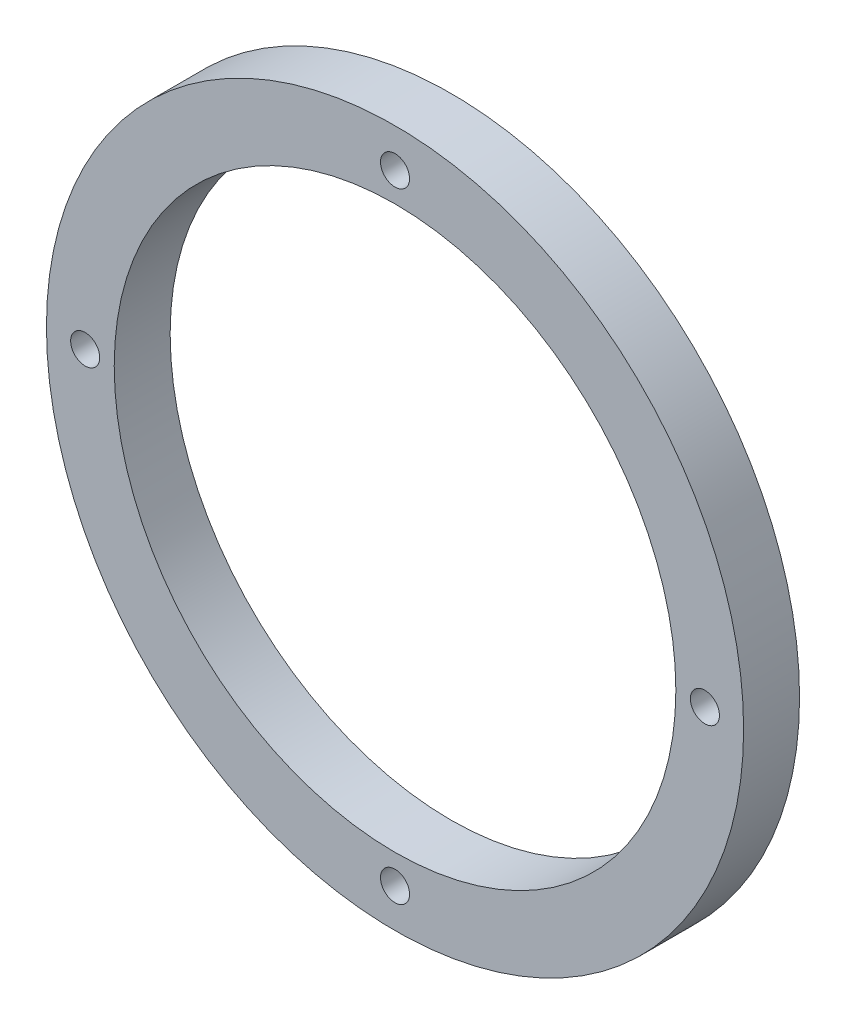
ISO-10303-21;
HEADER;
FILE_DESCRIPTION(('STEP AP214'),'2;1');
FILE_NAME('part.step','',(''),(''),'','','');
FILE_SCHEMA(('AUTOMOTIVE_DESIGN { 1 0 10303 214 1 1 1 1 }'));
ENDSEC;
DATA;
#1=APPLICATION_CONTEXT('core data for automotive mechanical design processes');
#2=APPLICATION_PROTOCOL_DEFINITION('international standard','automotive_design',2000,#1);
#3=PRODUCT_CONTEXT('',#1,'mechanical');
#4=PRODUCT('Part','Part','',(#3));
#5=PRODUCT_RELATED_PRODUCT_CATEGORY('part','',(#4));
#6=PRODUCT_DEFINITION_FORMATION('','',#4);
#7=PRODUCT_DEFINITION_CONTEXT('part definition',#1,'design');
#8=PRODUCT_DEFINITION('design','',#6,#7);
#9=PRODUCT_DEFINITION_SHAPE('','',#8);
#10=(LENGTH_UNIT() NAMED_UNIT(*) SI_UNIT(.MILLI.,.METRE.));
#11=(NAMED_UNIT(*) PLANE_ANGLE_UNIT() SI_UNIT($,.RADIAN.));
#12=(NAMED_UNIT(*) SI_UNIT($,.STERADIAN.) SOLID_ANGLE_UNIT());
#13=UNCERTAINTY_MEASURE_WITH_UNIT(LENGTH_MEASURE(1.E-05),#10,'distance_accuracy_value','');
#14=(GEOMETRIC_REPRESENTATION_CONTEXT(3) GLOBAL_UNCERTAINTY_ASSIGNED_CONTEXT((#13)) GLOBAL_UNIT_ASSIGNED_CONTEXT((#10,
#11,#12)) REPRESENTATION_CONTEXT('',''));
#15=CARTESIAN_POINT('',(0.,0.,0.));
#16=DIRECTION('',(0.,0.,1.));
#17=DIRECTION('',(1.,0.,0.));
#18=AXIS2_PLACEMENT_3D('',#15,#16,#17);
#19=CARTESIAN_POINT('',(0.,0.,9.1694));
#20=DIRECTION('',(0.,0.,1.));
#21=DIRECTION('',(1.,0.,0.));
#22=AXIS2_PLACEMENT_3D('',#19,#20,#21);
#23=PLANE('',#22);
#24=CARTESIAN_POINT('',(0.,-50.8,9.1694));
#25=DIRECTION('',(0.,0.,1.));
#26=DIRECTION('',(1.,0.,0.));
#27=AXIS2_PLACEMENT_3D('',#24,#25,#26);
#28=CIRCLE('',#27,2.38125000000034);
#29=CARTESIAN_POINT('',(2.38125000000034,-50.8,9.1694));
#30=VERTEX_POINT('',#29);
#31=EDGE_CURVE('E59',#30,#30,#28,.T.);
#32=ORIENTED_EDGE('',*,*,#31,.F.);
#33=EDGE_LOOP('',(#32));
#34=FACE_BOUND('',#33,.T.);
#35=CARTESIAN_POINT('',(0.,50.8,9.1694));
#36=DIRECTION('',(0.,0.,1.));
#37=DIRECTION('',(1.,0.,0.));
#38=AXIS2_PLACEMENT_3D('',#35,#36,#37);
#39=CIRCLE('',#38,2.38125);
#40=CARTESIAN_POINT('',(2.38125,50.8,9.1694));
#41=VERTEX_POINT('',#40);
#42=EDGE_CURVE('E47',#41,#41,#39,.T.);
#43=ORIENTED_EDGE('',*,*,#42,.F.);
#44=EDGE_LOOP('',(#43));
#45=FACE_BOUND('',#44,.T.);
#46=CARTESIAN_POINT('',(0.,0.,9.1694));
#47=DIRECTION('',(0.,0.,1.));
#48=DIRECTION('',(1.,0.,0.));
#49=AXIS2_PLACEMENT_3D('',#46,#47,#48);
#50=CIRCLE('',#49,57.15);
#51=CARTESIAN_POINT('',(57.15,0.,9.1694));
#52=VERTEX_POINT('',#51);
#53=EDGE_CURVE('E10',#52,#52,#50,.T.);
#54=ORIENTED_EDGE('',*,*,#53,.T.);
#55=EDGE_LOOP('',(#54));
#56=FACE_BOUND('',#55,.T.);
#57=CARTESIAN_POINT('',(0.,0.,9.1694));
#58=DIRECTION('',(0.,0.,1.));
#59=DIRECTION('',(1.,0.,0.));
#60=AXIS2_PLACEMENT_3D('',#57,#58,#59);
#61=CIRCLE('',#60,46.0375);
#62=CARTESIAN_POINT('',(46.0375,0.,9.1694));
#63=VERTEX_POINT('',#62);
#64=EDGE_CURVE('E42',#63,#63,#61,.T.);
#65=ORIENTED_EDGE('',*,*,#64,.F.);
#66=EDGE_LOOP('',(#65));
#67=FACE_BOUND('',#66,.T.);
#68=CARTESIAN_POINT('',(50.8,-1.77562969678171E-13,9.1694));
#69=DIRECTION('',(0.,0.,1.));
#70=DIRECTION('',(1.,0.,0.));
#71=AXIS2_PLACEMENT_3D('',#68,#69,#70);
#72=CIRCLE('',#71,2.38125);
#73=CARTESIAN_POINT('',(53.18125,-1.77562969678171E-13,9.1694));
#74=VERTEX_POINT('',#73);
#75=EDGE_CURVE('E53',#74,#74,#72,.T.);
#76=ORIENTED_EDGE('',*,*,#75,.F.);
#77=EDGE_LOOP('',(#76));
#78=FACE_BOUND('',#77,.T.);
#79=CARTESIAN_POINT('',(-50.8,5.32297473704634E-13,9.1694));
#80=DIRECTION('',(0.,0.,1.));
#81=DIRECTION('',(1.,0.,0.));
#82=AXIS2_PLACEMENT_3D('',#79,#80,#81);
#83=CIRCLE('',#82,2.38125);
#84=CARTESIAN_POINT('',(-48.41875,5.32297473704634E-13,9.1694));
#85=VERTEX_POINT('',#84);
#86=EDGE_CURVE('E65',#85,#85,#83,.T.);
#87=ORIENTED_EDGE('',*,*,#86,.F.);
#88=EDGE_LOOP('',(#87));
#89=FACE_BOUND('',#88,.T.);
#90=ADVANCED_FACE('F31',(#34,#45,#56,#67,#78,#89),#23,.T.);
#91=CARTESIAN_POINT('',(0.,0.,0.));
#92=DIRECTION('',(0.,0.,1.));
#93=DIRECTION('',(1.,0.,0.));
#94=AXIS2_PLACEMENT_3D('',#91,#92,#93);
#95=PLANE('',#94);
#96=CARTESIAN_POINT('',(0.,0.,0.));
#97=DIRECTION('',(0.,0.,1.));
#98=DIRECTION('',(1.,0.,0.));
#99=AXIS2_PLACEMENT_3D('',#96,#97,#98);
#100=CIRCLE('',#99,57.15);
#101=CARTESIAN_POINT('',(57.15,0.,0.));
#102=VERTEX_POINT('',#101);
#103=EDGE_CURVE('E35',#102,#102,#100,.T.);
#104=ORIENTED_EDGE('',*,*,#103,.F.);
#105=EDGE_LOOP('',(#104));
#106=FACE_BOUND('',#105,.T.);
#107=CARTESIAN_POINT('',(0.,0.,0.));
#108=DIRECTION('',(0.,0.,1.));
#109=DIRECTION('',(1.,0.,0.));
#110=AXIS2_PLACEMENT_3D('',#107,#108,#109);
#111=CIRCLE('',#110,46.0375);
#112=CARTESIAN_POINT('',(46.0375,0.,0.));
#113=VERTEX_POINT('',#112);
#114=EDGE_CURVE('E44',#113,#113,#111,.T.);
#115=ORIENTED_EDGE('',*,*,#114,.T.);
#116=EDGE_LOOP('',(#115));
#117=FACE_BOUND('',#116,.T.);
#118=CARTESIAN_POINT('',(0.,50.8,0.));
#119=DIRECTION('',(0.,0.,1.));
#120=DIRECTION('',(1.,0.,0.));
#121=AXIS2_PLACEMENT_3D('',#118,#119,#120);
#122=CIRCLE('',#121,2.38125);
#123=CARTESIAN_POINT('',(2.38125,50.8,0.));
#124=VERTEX_POINT('',#123);
#125=EDGE_CURVE('E50',#124,#124,#122,.T.);
#126=ORIENTED_EDGE('',*,*,#125,.T.);
#127=EDGE_LOOP('',(#126));
#128=FACE_BOUND('',#127,.T.);
#129=CARTESIAN_POINT('',(50.8,-1.77562969678171E-13,0.));
#130=DIRECTION('',(0.,0.,1.));
#131=DIRECTION('',(1.,0.,0.));
#132=AXIS2_PLACEMENT_3D('',#129,#130,#131);
#133=CIRCLE('',#132,2.38125);
#134=CARTESIAN_POINT('',(53.18125,-1.77562969678171E-13,0.));
#135=VERTEX_POINT('',#134);
#136=EDGE_CURVE('E56',#135,#135,#133,.T.);
#137=ORIENTED_EDGE('',*,*,#136,.T.);
#138=EDGE_LOOP('',(#137));
#139=FACE_BOUND('',#138,.T.);
#140=CARTESIAN_POINT('',(0.,-50.8,0.));
#141=DIRECTION('',(0.,0.,1.));
#142=DIRECTION('',(1.,0.,0.));
#143=AXIS2_PLACEMENT_3D('',#140,#141,#142);
#144=CIRCLE('',#143,2.38125000000034);
#145=CARTESIAN_POINT('',(2.38125000000034,-50.8,0.));
#146=VERTEX_POINT('',#145);
#147=EDGE_CURVE('E62',#146,#146,#144,.T.);
#148=ORIENTED_EDGE('',*,*,#147,.T.);
#149=EDGE_LOOP('',(#148));
#150=FACE_BOUND('',#149,.T.);
#151=CARTESIAN_POINT('',(-50.8,5.32297473704634E-13,0.));
#152=DIRECTION('',(0.,0.,1.));
#153=DIRECTION('',(1.,0.,0.));
#154=AXIS2_PLACEMENT_3D('',#151,#152,#153);
#155=CIRCLE('',#154,2.38125);
#156=CARTESIAN_POINT('',(-48.41875,5.32297473704634E-13,0.));
#157=VERTEX_POINT('',#156);
#158=EDGE_CURVE('E68',#157,#157,#155,.T.);
#159=ORIENTED_EDGE('',*,*,#158,.T.);
#160=EDGE_LOOP('',(#159));
#161=FACE_BOUND('',#160,.T.);
#162=ADVANCED_FACE('F78',(#106,#117,#128,#139,#150,#161),#95,.F.);
#163=CARTESIAN_POINT('',(0.,0.,9.1694));
#164=DIRECTION('',(0.,0.,-1.));
#165=DIRECTION('',(-1.,0.,0.));
#166=AXIS2_PLACEMENT_3D('',#163,#164,#165);
#167=CYLINDRICAL_SURFACE('',#166,57.15);
#168=ORIENTED_EDGE('',*,*,#53,.F.);
#169=EDGE_LOOP('',(#168));
#170=FACE_BOUND('',#169,.T.);
#171=ORIENTED_EDGE('',*,*,#103,.T.);
#172=EDGE_LOOP('',(#171));
#173=FACE_BOUND('',#172,.T.);
#174=ADVANCED_FACE('F33',(#170,#173),#167,.T.);
#175=CARTESIAN_POINT('',(0.,0.,9.1694));
#176=DIRECTION('',(0.,0.,-1.));
#177=DIRECTION('',(-1.,0.,0.));
#178=AXIS2_PLACEMENT_3D('',#175,#176,#177);
#179=CYLINDRICAL_SURFACE('',#178,46.0375);
#180=ORIENTED_EDGE('',*,*,#64,.T.);
#181=EDGE_LOOP('',(#180));
#182=FACE_BOUND('',#181,.T.);
#183=ORIENTED_EDGE('',*,*,#114,.F.);
#184=EDGE_LOOP('',(#183));
#185=FACE_BOUND('',#184,.T.);
#186=ADVANCED_FACE('F88',(#182,#185),#179,.F.);
#187=CARTESIAN_POINT('',(0.,50.8,9.1694));
#188=DIRECTION('',(0.,0.,-1.));
#189=DIRECTION('',(-1.,0.,0.));
#190=AXIS2_PLACEMENT_3D('',#187,#188,#189);
#191=CYLINDRICAL_SURFACE('',#190,2.38125);
#192=ORIENTED_EDGE('',*,*,#42,.T.);
#193=EDGE_LOOP('',(#192));
#194=FACE_BOUND('',#193,.T.);
#195=ORIENTED_EDGE('',*,*,#125,.F.);
#196=EDGE_LOOP('',(#195));
#197=FACE_BOUND('',#196,.T.);
#198=ADVANCED_FACE('F91',(#194,#197),#191,.F.);
#199=CARTESIAN_POINT('',(50.8,-1.77562969678171E-13,9.1694));
#200=DIRECTION('',(0.,0.,-1.));
#201=DIRECTION('',(-1.,0.,0.));
#202=AXIS2_PLACEMENT_3D('',#199,#200,#201);
#203=CYLINDRICAL_SURFACE('',#202,2.38125);
#204=ORIENTED_EDGE('',*,*,#75,.T.);
#205=EDGE_LOOP('',(#204));
#206=FACE_BOUND('',#205,.T.);
#207=ORIENTED_EDGE('',*,*,#136,.F.);
#208=EDGE_LOOP('',(#207));
#209=FACE_BOUND('',#208,.T.);
#210=ADVANCED_FACE('F95',(#206,#209),#203,.F.);
#211=CARTESIAN_POINT('',(0.,-50.8,9.1694));
#212=DIRECTION('',(0.,0.,-1.));
#213=DIRECTION('',(-1.,0.,0.));
#214=AXIS2_PLACEMENT_3D('',#211,#212,#213);
#215=CYLINDRICAL_SURFACE('',#214,2.38125000000034);
#216=ORIENTED_EDGE('',*,*,#31,.T.);
#217=EDGE_LOOP('',(#216));
#218=FACE_BOUND('',#217,.T.);
#219=ORIENTED_EDGE('',*,*,#147,.F.);
#220=EDGE_LOOP('',(#219));
#221=FACE_BOUND('',#220,.T.);
#222=ADVANCED_FACE('F99',(#218,#221),#215,.F.);
#223=CARTESIAN_POINT('',(-50.8,5.32297473704634E-13,9.1694));
#224=DIRECTION('',(0.,0.,-1.));
#225=DIRECTION('',(-1.,0.,0.));
#226=AXIS2_PLACEMENT_3D('',#223,#224,#225);
#227=CYLINDRICAL_SURFACE('',#226,2.38125);
#228=ORIENTED_EDGE('',*,*,#86,.T.);
#229=EDGE_LOOP('',(#228));
#230=FACE_BOUND('',#229,.T.);
#231=ORIENTED_EDGE('',*,*,#158,.F.);
#232=EDGE_LOOP('',(#231));
#233=FACE_BOUND('',#232,.T.);
#234=ADVANCED_FACE('F74',(#230,#233),#227,.F.);
#235=CLOSED_SHELL('',(#90,#162,#174,#186,#198,#210,#222,#234));
#236=MANIFOLD_SOLID_BREP('B2',#235);
#237=ADVANCED_BREP_SHAPE_REPRESENTATION('',(#18,#236),#14);
#238=SHAPE_DEFINITION_REPRESENTATION(#9,#237);
ENDSEC;
END-ISO-10303-21;
